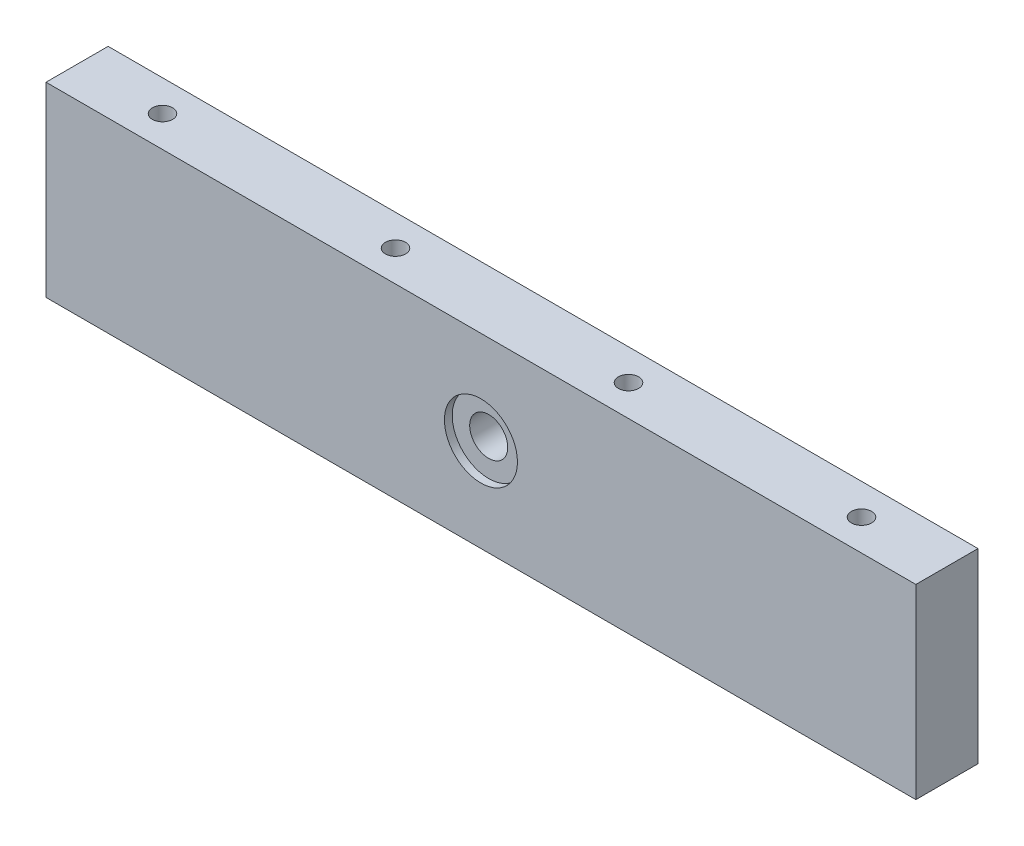
ISO-10303-21;
HEADER;
FILE_DESCRIPTION(('STEP AP214'),'2;1');
FILE_NAME('part.step','',(''),(''),'','','');
FILE_SCHEMA(('AUTOMOTIVE_DESIGN { 1 0 10303 214 1 1 1 1 }'));
ENDSEC;
DATA;
#1=APPLICATION_CONTEXT('core data for automotive mechanical design processes');
#2=APPLICATION_PROTOCOL_DEFINITION('international standard','automotive_design',2000,#1);
#3=PRODUCT_CONTEXT('',#1,'mechanical');
#4=PRODUCT('Part','Part','',(#3));
#5=PRODUCT_RELATED_PRODUCT_CATEGORY('part','',(#4));
#6=PRODUCT_DEFINITION_FORMATION('','',#4);
#7=PRODUCT_DEFINITION_CONTEXT('part definition',#1,'design');
#8=PRODUCT_DEFINITION('design','',#6,#7);
#9=PRODUCT_DEFINITION_SHAPE('','',#8);
#10=(LENGTH_UNIT() NAMED_UNIT(*) SI_UNIT(.MILLI.,.METRE.));
#11=(NAMED_UNIT(*) PLANE_ANGLE_UNIT() SI_UNIT($,.RADIAN.));
#12=(NAMED_UNIT(*) SI_UNIT($,.STERADIAN.) SOLID_ANGLE_UNIT());
#13=UNCERTAINTY_MEASURE_WITH_UNIT(LENGTH_MEASURE(1.E-05),#10,'distance_accuracy_value','');
#14=(GEOMETRIC_REPRESENTATION_CONTEXT(3) GLOBAL_UNCERTAINTY_ASSIGNED_CONTEXT((#13)) GLOBAL_UNIT_ASSIGNED_CONTEXT((#10,
#11,#12)) REPRESENTATION_CONTEXT('',''));
#15=CARTESIAN_POINT('',(0.,0.,0.));
#16=DIRECTION('',(0.,0.,1.));
#17=DIRECTION('',(1.,0.,0.));
#18=AXIS2_PLACEMENT_3D('',#15,#16,#17);
#19=CARTESIAN_POINT('',(0.,0.,30.));
#20=DIRECTION('',(0.,0.,-1.));
#21=DIRECTION('',(-1.,0.,0.));
#22=AXIS2_PLACEMENT_3D('',#19,#20,#21);
#23=CYLINDRICAL_SURFACE('',#22,2.45);
#24=CARTESIAN_POINT('',(0.,0.,2.));
#25=DIRECTION('',(0.,0.,-1.));
#26=DIRECTION('',(-1.,0.,0.));
#27=AXIS2_PLACEMENT_3D('',#24,#25,#26);
#28=CIRCLE('',#27,2.45);
#29=CARTESIAN_POINT('',(-2.45,0.,2.));
#30=VERTEX_POINT('',#29);
#31=EDGE_CURVE('E173',#30,#30,#28,.F.);
#32=ORIENTED_EDGE('',*,*,#31,.F.);
#33=EDGE_LOOP('',(#32));
#34=FACE_BOUND('',#33,.T.);
#35=CARTESIAN_POINT('',(0.,0.,7.));
#36=DIRECTION('',(0.,0.,1.));
#37=DIRECTION('',(1.,0.,0.));
#38=AXIS2_PLACEMENT_3D('',#35,#36,#37);
#39=CIRCLE('',#38,2.45);
#40=CARTESIAN_POINT('',(2.45,0.,7.));
#41=VERTEX_POINT('',#40);
#42=EDGE_CURVE('E38',#41,#41,#39,.F.);
#43=ORIENTED_EDGE('',*,*,#42,.F.);
#44=EDGE_LOOP('',(#43));
#45=FACE_BOUND('',#44,.T.);
#46=ADVANCED_FACE('F34',(#34,#45),#23,.F.);
#47=CARTESIAN_POINT('',(56.,-12.,8.));
#48=DIRECTION('',(-1.,0.,0.));
#49=DIRECTION('',(0.,0.,1.));
#50=AXIS2_PLACEMENT_3D('',#47,#48,#49);
#51=PLANE('',#50);
#52=DIRECTION('',(0.,1.,0.));
#53=VECTOR('',#52,1.);
#54=CARTESIAN_POINT('',(56.,-12.,0.));
#55=LINE('',#54,#53);
#56=CARTESIAN_POINT('',(56.,-12.,0.));
#57=VERTEX_POINT('',#56);
#58=CARTESIAN_POINT('',(56.,12.,0.));
#59=VERTEX_POINT('',#58);
#60=EDGE_CURVE('E204',#57,#59,#55,.T.);
#61=ORIENTED_EDGE('',*,*,#60,.T.);
#62=DIRECTION('',(0.,0.,-1.));
#63=VECTOR('',#62,1.);
#64=CARTESIAN_POINT('',(56.,12.,8.));
#65=LINE('',#64,#63);
#66=CARTESIAN_POINT('',(56.,12.,8.));
#67=VERTEX_POINT('',#66);
#68=EDGE_CURVE('E11',#67,#59,#65,.T.);
#69=ORIENTED_EDGE('',*,*,#68,.F.);
#70=DIRECTION('',(0.,1.,0.));
#71=VECTOR('',#70,1.);
#72=CARTESIAN_POINT('',(56.,-12.,8.));
#73=LINE('',#72,#71);
#74=CARTESIAN_POINT('',(56.,-12.,8.));
#75=VERTEX_POINT('',#74);
#76=EDGE_CURVE('E197',#75,#67,#73,.T.);
#77=ORIENTED_EDGE('',*,*,#76,.F.);
#78=DIRECTION('',(0.,0.,-1.));
#79=VECTOR('',#78,1.);
#80=CARTESIAN_POINT('',(56.,-12.,8.));
#81=LINE('',#80,#79);
#82=EDGE_CURVE('E203',#75,#57,#81,.T.);
#83=ORIENTED_EDGE('',*,*,#82,.T.);
#84=EDGE_LOOP('',(#61,#69,#77,#83));
#85=FACE_BOUND('',#84,.T.);
#86=ADVANCED_FACE('F36',(#85),#51,.F.);
#87=CARTESIAN_POINT('',(-56.,12.,8.));
#88=DIRECTION('',(0.,-1.,0.));
#89=DIRECTION('',(0.,0.,-1.));
#90=AXIS2_PLACEMENT_3D('',#87,#88,#89);
#91=PLANE('',#90);
#92=CARTESIAN_POINT('',(15.0000000000001,12.,4.));
#93=DIRECTION('',(0.,1.,0.));
#94=DIRECTION('',(0.,0.,-1.));
#95=AXIS2_PLACEMENT_3D('',#92,#93,#94);
#96=CIRCLE('',#95,1.3);
#97=CARTESIAN_POINT('',(15.0000000000001,12.,2.7));
#98=VERTEX_POINT('',#97);
#99=EDGE_CURVE('E181',#98,#98,#96,.T.);
#100=ORIENTED_EDGE('',*,*,#99,.F.);
#101=EDGE_LOOP('',(#100));
#102=FACE_BOUND('',#101,.T.);
#103=CARTESIAN_POINT('',(45.0000000000001,12.,4.));
#104=DIRECTION('',(0.,1.,0.));
#105=DIRECTION('',(0.,0.,-1.));
#106=AXIS2_PLACEMENT_3D('',#103,#104,#105);
#107=CIRCLE('',#106,1.3);
#108=CARTESIAN_POINT('',(45.0000000000001,12.,2.7));
#109=VERTEX_POINT('',#108);
#110=EDGE_CURVE('E185',#109,#109,#107,.T.);
#111=ORIENTED_EDGE('',*,*,#110,.F.);
#112=EDGE_LOOP('',(#111));
#113=FACE_BOUND('',#112,.T.);
#114=CARTESIAN_POINT('',(-45.,12.,4.));
#115=DIRECTION('',(0.,1.,0.));
#116=DIRECTION('',(0.,0.,1.));
#117=AXIS2_PLACEMENT_3D('',#114,#115,#116);
#118=CIRCLE('',#117,1.3);
#119=CARTESIAN_POINT('',(-45.,12.,5.3));
#120=VERTEX_POINT('',#119);
#121=EDGE_CURVE('E189',#120,#120,#118,.T.);
#122=ORIENTED_EDGE('',*,*,#121,.F.);
#123=EDGE_LOOP('',(#122));
#124=FACE_BOUND('',#123,.T.);
#125=CARTESIAN_POINT('',(-15.,12.,4.));
#126=DIRECTION('',(0.,1.,0.));
#127=DIRECTION('',(0.,0.,1.));
#128=AXIS2_PLACEMENT_3D('',#125,#126,#127);
#129=CIRCLE('',#128,1.3);
#130=CARTESIAN_POINT('',(-15.,12.,5.3));
#131=VERTEX_POINT('',#130);
#132=EDGE_CURVE('E193',#131,#131,#129,.T.);
#133=ORIENTED_EDGE('',*,*,#132,.F.);
#134=EDGE_LOOP('',(#133));
#135=FACE_BOUND('',#134,.T.);
#136=DIRECTION('',(-1.,0.,0.));
#137=VECTOR('',#136,1.);
#138=CARTESIAN_POINT('',(-56.,12.,0.));
#139=LINE('',#138,#137);
#140=CARTESIAN_POINT('',(-56.,12.,0.));
#141=VERTEX_POINT('',#140);
#142=EDGE_CURVE('E207',#59,#141,#139,.T.);
#143=ORIENTED_EDGE('',*,*,#142,.T.);
#144=DIRECTION('',(0.,0.,-1.));
#145=VECTOR('',#144,1.);
#146=CARTESIAN_POINT('',(-56.,12.,8.));
#147=LINE('',#146,#145);
#148=CARTESIAN_POINT('',(-56.,12.,8.));
#149=VERTEX_POINT('',#148);
#150=EDGE_CURVE('E43',#149,#141,#147,.T.);
#151=ORIENTED_EDGE('',*,*,#150,.F.);
#152=DIRECTION('',(-1.,0.,0.));
#153=VECTOR('',#152,1.);
#154=CARTESIAN_POINT('',(-56.,12.,8.));
#155=LINE('',#154,#153);
#156=EDGE_CURVE('E88',#67,#149,#155,.T.);
#157=ORIENTED_EDGE('',*,*,#156,.F.);
#158=ORIENTED_EDGE('',*,*,#68,.T.);
#159=EDGE_LOOP('',(#143,#151,#157,#158));
#160=FACE_BOUND('',#159,.T.);
#161=ADVANCED_FACE('F251',(#102,#113,#124,#135,#160),#91,.F.);
#162=CARTESIAN_POINT('',(-56.,-12.,8.));
#163=DIRECTION('',(1.,0.,0.));
#164=DIRECTION('',(0.,0.,-1.));
#165=AXIS2_PLACEMENT_3D('',#162,#163,#164);
#166=PLANE('',#165);
#167=DIRECTION('',(0.,-1.,0.));
#168=VECTOR('',#167,1.);
#169=CARTESIAN_POINT('',(-56.,-12.,0.));
#170=LINE('',#169,#168);
#171=CARTESIAN_POINT('',(-56.,-12.,0.));
#172=VERTEX_POINT('',#171);
#173=EDGE_CURVE('E209',#141,#172,#170,.T.);
#174=ORIENTED_EDGE('',*,*,#173,.T.);
#175=DIRECTION('',(0.,0.,-1.));
#176=VECTOR('',#175,1.);
#177=CARTESIAN_POINT('',(-56.,-12.,8.));
#178=LINE('',#177,#176);
#179=CARTESIAN_POINT('',(-56.,-12.,8.));
#180=VERTEX_POINT('',#179);
#181=EDGE_CURVE('E213',#180,#172,#178,.T.);
#182=ORIENTED_EDGE('',*,*,#181,.F.);
#183=DIRECTION('',(0.,-1.,0.));
#184=VECTOR('',#183,1.);
#185=CARTESIAN_POINT('',(-56.,-12.,8.));
#186=LINE('',#185,#184);
#187=EDGE_CURVE('E200',#149,#180,#186,.T.);
#188=ORIENTED_EDGE('',*,*,#187,.F.);
#189=ORIENTED_EDGE('',*,*,#150,.T.);
#190=EDGE_LOOP('',(#174,#182,#188,#189));
#191=FACE_BOUND('',#190,.T.);
#192=ADVANCED_FACE('F256',(#191),#166,.F.);
#193=CARTESIAN_POINT('',(-56.,-12.,8.));
#194=DIRECTION('',(0.,1.,0.));
#195=DIRECTION('',(0.,0.,1.));
#196=AXIS2_PLACEMENT_3D('',#193,#194,#195);
#197=PLANE('',#196);
#198=CARTESIAN_POINT('',(15.0000000000001,-12.,4.));
#199=DIRECTION('',(0.,1.,0.));
#200=DIRECTION('',(0.,0.,1.));
#201=AXIS2_PLACEMENT_3D('',#198,#199,#200);
#202=CIRCLE('',#201,1.3);
#203=CARTESIAN_POINT('',(15.0000000000001,-12.,5.3));
#204=VERTEX_POINT('',#203);
#205=EDGE_CURVE('E184',#204,#204,#202,.T.);
#206=ORIENTED_EDGE('',*,*,#205,.T.);
#207=EDGE_LOOP('',(#206));
#208=FACE_BOUND('',#207,.T.);
#209=CARTESIAN_POINT('',(45.0000000000001,-12.,4.));
#210=DIRECTION('',(0.,1.,0.));
#211=DIRECTION('',(0.,0.,1.));
#212=AXIS2_PLACEMENT_3D('',#209,#210,#211);
#213=CIRCLE('',#212,1.3);
#214=CARTESIAN_POINT('',(45.0000000000001,-12.,5.3));
#215=VERTEX_POINT('',#214);
#216=EDGE_CURVE('E188',#215,#215,#213,.T.);
#217=ORIENTED_EDGE('',*,*,#216,.T.);
#218=EDGE_LOOP('',(#217));
#219=FACE_BOUND('',#218,.T.);
#220=CARTESIAN_POINT('',(-45.,-12.,4.));
#221=DIRECTION('',(0.,1.,0.));
#222=DIRECTION('',(0.,0.,1.));
#223=AXIS2_PLACEMENT_3D('',#220,#221,#222);
#224=CIRCLE('',#223,1.3);
#225=CARTESIAN_POINT('',(-45.,-12.,5.3));
#226=VERTEX_POINT('',#225);
#227=EDGE_CURVE('E192',#226,#226,#224,.T.);
#228=ORIENTED_EDGE('',*,*,#227,.T.);
#229=EDGE_LOOP('',(#228));
#230=FACE_BOUND('',#229,.T.);
#231=CARTESIAN_POINT('',(-15.,-12.,4.));
#232=DIRECTION('',(0.,1.,0.));
#233=DIRECTION('',(0.,0.,1.));
#234=AXIS2_PLACEMENT_3D('',#231,#232,#233);
#235=CIRCLE('',#234,1.3);
#236=CARTESIAN_POINT('',(-15.,-12.,5.3));
#237=VERTEX_POINT('',#236);
#238=EDGE_CURVE('E196',#237,#237,#235,.T.);
#239=ORIENTED_EDGE('',*,*,#238,.T.);
#240=EDGE_LOOP('',(#239));
#241=FACE_BOUND('',#240,.T.);
#242=DIRECTION('',(1.,0.,0.));
#243=VECTOR('',#242,1.);
#244=CARTESIAN_POINT('',(-56.,-12.,0.));
#245=LINE('',#244,#243);
#246=EDGE_CURVE('E81',#172,#57,#245,.T.);
#247=ORIENTED_EDGE('',*,*,#246,.T.);
#248=ORIENTED_EDGE('',*,*,#82,.F.);
#249=DIRECTION('',(1.,0.,0.));
#250=VECTOR('',#249,1.);
#251=CARTESIAN_POINT('',(-56.,-12.,8.));
#252=LINE('',#251,#250);
#253=EDGE_CURVE('E60',#180,#75,#252,.T.);
#254=ORIENTED_EDGE('',*,*,#253,.F.);
#255=ORIENTED_EDGE('',*,*,#181,.T.);
#256=EDGE_LOOP('',(#247,#248,#254,#255));
#257=FACE_BOUND('',#256,.T.);
#258=ADVANCED_FACE('F245',(#208,#219,#230,#241,#257),#197,.F.);
#259=CARTESIAN_POINT('',(0.,0.,8.));
#260=DIRECTION('',(0.,0.,-1.));
#261=DIRECTION('',(-1.,0.,0.));
#262=AXIS2_PLACEMENT_3D('',#259,#260,#261);
#263=PLANE('',#262);
#264=CARTESIAN_POINT('',(0.,0.,8.));
#265=DIRECTION('',(0.,0.,1.));
#266=DIRECTION('',(1.,0.,0.));
#267=AXIS2_PLACEMENT_3D('',#264,#265,#266);
#268=CIRCLE('',#267,4.7);
#269=CARTESIAN_POINT('',(4.7,0.,8.));
#270=VERTEX_POINT('',#269);
#271=EDGE_CURVE('E150',#270,#270,#268,.T.);
#272=ORIENTED_EDGE('',*,*,#271,.F.);
#273=EDGE_LOOP('',(#272));
#274=FACE_BOUND('',#273,.T.);
#275=ORIENTED_EDGE('',*,*,#76,.T.);
#276=ORIENTED_EDGE('',*,*,#156,.T.);
#277=ORIENTED_EDGE('',*,*,#187,.T.);
#278=ORIENTED_EDGE('',*,*,#253,.T.);
#279=EDGE_LOOP('',(#275,#276,#277,#278));
#280=FACE_BOUND('',#279,.T.);
#281=ADVANCED_FACE('F242',(#274,#280),#263,.F.);
#282=CARTESIAN_POINT('',(0.,0.,0.));
#283=DIRECTION('',(0.,0.,-1.));
#284=DIRECTION('',(-1.,0.,0.));
#285=AXIS2_PLACEMENT_3D('',#282,#283,#284);
#286=PLANE('',#285);
#287=DIRECTION('',(-0.827725914255366,0.561132614334721,0.));
#288=VECTOR('',#287,1.);
#289=CARTESIAN_POINT('',(-0.324654856204209,-4.49161432275114,0.));
#290=LINE('',#289,#288);
#291=CARTESIAN_POINT('',(-0.324654856204209,-4.49161432275114,0.));
#292=VERTEX_POINT('',#291);
#293=CARTESIAN_POINT('',(-4.05217953560663,-1.96464780844074,0.));
#294=VERTEX_POINT('',#293);
#295=EDGE_CURVE('E51',#292,#294,#290,.T.);
#296=ORIENTED_EDGE('',*,*,#295,.F.);
#297=DIRECTION('',(-0.899818056033527,-0.436265361948487,0.));
#298=VECTOR('',#297,1.);
#299=CARTESIAN_POINT('',(3.72752467940242,-2.5269665143104,0.));
#300=LINE('',#299,#298);
#301=CARTESIAN_POINT('',(3.72752467940242,-2.5269665143104,0.));
#302=VERTEX_POINT('',#301);
#303=EDGE_CURVE('E144',#302,#292,#300,.T.);
#304=ORIENTED_EDGE('',*,*,#303,.F.);
#305=DIRECTION('',(-0.072092141778161,-0.997397976283207,0.));
#306=VECTOR('',#305,1.);
#307=CARTESIAN_POINT('',(4.05217953560663,1.96464780844074,0.));
#308=LINE('',#307,#306);
#309=CARTESIAN_POINT('',(4.05217953560663,1.96464780844074,0.));
#310=VERTEX_POINT('',#309);
#311=EDGE_CURVE('E147',#310,#302,#308,.T.);
#312=ORIENTED_EDGE('',*,*,#311,.F.);
#313=DIRECTION('',(0.827725914255366,-0.561132614334721,0.));
#314=VECTOR('',#313,1.);
#315=CARTESIAN_POINT('',(0.324654856204211,4.49161432275114,0.));
#316=LINE('',#315,#314);
#317=CARTESIAN_POINT('',(0.324654856204211,4.49161432275114,0.));
#318=VERTEX_POINT('',#317);
#319=EDGE_CURVE('E166',#318,#310,#316,.T.);
#320=ORIENTED_EDGE('',*,*,#319,.F.);
#321=DIRECTION('',(0.899818056033527,0.436265361948487,0.));
#322=VECTOR('',#321,1.);
#323=CARTESIAN_POINT('',(-3.72752467940242,2.5269665143104,0.));
#324=LINE('',#323,#322);
#325=CARTESIAN_POINT('',(-3.72752467940242,2.5269665143104,0.));
#326=VERTEX_POINT('',#325);
#327=EDGE_CURVE('E163',#326,#318,#324,.T.);
#328=ORIENTED_EDGE('',*,*,#327,.F.);
#329=DIRECTION('',(0.0720921417781608,0.997397976283207,0.));
#330=VECTOR('',#329,1.);
#331=CARTESIAN_POINT('',(-4.05217953560663,-1.96464780844074,0.));
#332=LINE('',#331,#330);
#333=EDGE_CURVE('E161',#294,#326,#332,.T.);
#334=ORIENTED_EDGE('',*,*,#333,.F.);
#335=EDGE_LOOP('',(#296,#304,#312,#320,#328,#334));
#336=FACE_BOUND('',#335,.T.);
#337=ORIENTED_EDGE('',*,*,#60,.F.);
#338=ORIENTED_EDGE('',*,*,#246,.F.);
#339=ORIENTED_EDGE('',*,*,#173,.F.);
#340=ORIENTED_EDGE('',*,*,#142,.F.);
#341=EDGE_LOOP('',(#337,#338,#339,#340));
#342=FACE_BOUND('',#341,.T.);
#343=ADVANCED_FACE('F244',(#336,#342),#286,.T.);
#344=CARTESIAN_POINT('',(-15.,-18.,4.));
#345=DIRECTION('',(0.,1.,0.));
#346=DIRECTION('',(0.,0.,1.));
#347=AXIS2_PLACEMENT_3D('',#344,#345,#346);
#348=CYLINDRICAL_SURFACE('',#347,1.3);
#349=ORIENTED_EDGE('',*,*,#132,.T.);
#350=EDGE_LOOP('',(#349));
#351=FACE_BOUND('',#350,.T.);
#352=ORIENTED_EDGE('',*,*,#238,.F.);
#353=EDGE_LOOP('',(#352));
#354=FACE_BOUND('',#353,.T.);
#355=ADVANCED_FACE('F259',(#351,#354),#348,.F.);
#356=CARTESIAN_POINT('',(-45.,-18.,4.));
#357=DIRECTION('',(0.,1.,0.));
#358=DIRECTION('',(0.,0.,1.));
#359=AXIS2_PLACEMENT_3D('',#356,#357,#358);
#360=CYLINDRICAL_SURFACE('',#359,1.3);
#361=ORIENTED_EDGE('',*,*,#121,.T.);
#362=EDGE_LOOP('',(#361));
#363=FACE_BOUND('',#362,.T.);
#364=ORIENTED_EDGE('',*,*,#227,.F.);
#365=EDGE_LOOP('',(#364));
#366=FACE_BOUND('',#365,.T.);
#367=ADVANCED_FACE('F265',(#363,#366),#360,.F.);
#368=CARTESIAN_POINT('',(45.0000000000001,-18.,4.));
#369=DIRECTION('',(0.,1.,0.));
#370=DIRECTION('',(0.,0.,1.));
#371=AXIS2_PLACEMENT_3D('',#368,#369,#370);
#372=CYLINDRICAL_SURFACE('',#371,1.3);
#373=ORIENTED_EDGE('',*,*,#110,.T.);
#374=EDGE_LOOP('',(#373));
#375=FACE_BOUND('',#374,.T.);
#376=ORIENTED_EDGE('',*,*,#216,.F.);
#377=EDGE_LOOP('',(#376));
#378=FACE_BOUND('',#377,.T.);
#379=ADVANCED_FACE('F291',(#375,#378),#372,.F.);
#380=CARTESIAN_POINT('',(15.0000000000001,-18.,4.));
#381=DIRECTION('',(0.,1.,0.));
#382=DIRECTION('',(0.,0.,1.));
#383=AXIS2_PLACEMENT_3D('',#380,#381,#382);
#384=CYLINDRICAL_SURFACE('',#383,1.3);
#385=ORIENTED_EDGE('',*,*,#99,.T.);
#386=EDGE_LOOP('',(#385));
#387=FACE_BOUND('',#386,.T.);
#388=ORIENTED_EDGE('',*,*,#205,.F.);
#389=EDGE_LOOP('',(#388));
#390=FACE_BOUND('',#389,.T.);
#391=ADVANCED_FACE('F298',(#387,#390),#384,.F.);
#392=CARTESIAN_POINT('',(0.,0.,2.));
#393=DIRECTION('',(0.,0.,-1.));
#394=DIRECTION('',(-1.,0.,0.));
#395=AXIS2_PLACEMENT_3D('',#392,#393,#394);
#396=PLANE('',#395);
#397=DIRECTION('',(-0.827725914255366,0.561132614334721,0.));
#398=VECTOR('',#397,1.);
#399=CARTESIAN_POINT('',(-0.324654856204209,-4.49161432275114,2.));
#400=LINE('',#399,#398);
#401=CARTESIAN_POINT('',(-0.324654856204209,-4.49161432275114,2.));
#402=VERTEX_POINT('',#401);
#403=CARTESIAN_POINT('',(-4.05217953560663,-1.96464780844074,2.));
#404=VERTEX_POINT('',#403);
#405=EDGE_CURVE('E124',#402,#404,#400,.T.);
#406=ORIENTED_EDGE('',*,*,#405,.T.);
#407=DIRECTION('',(0.0720921417781608,0.997397976283207,0.));
#408=VECTOR('',#407,1.);
#409=CARTESIAN_POINT('',(-4.05217953560663,-1.96464780844074,2.));
#410=LINE('',#409,#408);
#411=CARTESIAN_POINT('',(-3.72752467940242,2.5269665143104,2.));
#412=VERTEX_POINT('',#411);
#413=EDGE_CURVE('E133',#404,#412,#410,.T.);
#414=ORIENTED_EDGE('',*,*,#413,.T.);
#415=DIRECTION('',(0.899818056033527,0.436265361948487,0.));
#416=VECTOR('',#415,1.);
#417=CARTESIAN_POINT('',(-3.72752467940242,2.5269665143104,2.));
#418=LINE('',#417,#416);
#419=CARTESIAN_POINT('',(0.324654856204211,4.49161432275114,2.));
#420=VERTEX_POINT('',#419);
#421=EDGE_CURVE('E138',#412,#420,#418,.T.);
#422=ORIENTED_EDGE('',*,*,#421,.T.);
#423=DIRECTION('',(0.827725914255366,-0.561132614334721,0.));
#424=VECTOR('',#423,1.);
#425=CARTESIAN_POINT('',(0.324654856204211,4.49161432275114,2.));
#426=LINE('',#425,#424);
#427=CARTESIAN_POINT('',(4.05217953560663,1.96464780844074,2.));
#428=VERTEX_POINT('',#427);
#429=EDGE_CURVE('E154',#420,#428,#426,.T.);
#430=ORIENTED_EDGE('',*,*,#429,.T.);
#431=DIRECTION('',(-0.072092141778161,-0.997397976283207,0.));
#432=VECTOR('',#431,1.);
#433=CARTESIAN_POINT('',(4.05217953560663,1.96464780844074,2.));
#434=LINE('',#433,#432);
#435=CARTESIAN_POINT('',(3.72752467940242,-2.5269665143104,2.));
#436=VERTEX_POINT('',#435);
#437=EDGE_CURVE('E157',#428,#436,#434,.T.);
#438=ORIENTED_EDGE('',*,*,#437,.T.);
#439=DIRECTION('',(-0.899818056033527,-0.436265361948487,0.));
#440=VECTOR('',#439,1.);
#441=CARTESIAN_POINT('',(3.72752467940242,-2.5269665143104,2.));
#442=LINE('',#441,#440);
#443=EDGE_CURVE('E130',#436,#402,#442,.T.);
#444=ORIENTED_EDGE('',*,*,#443,.T.);
#445=EDGE_LOOP('',(#406,#414,#422,#430,#438,#444));
#446=FACE_BOUND('',#445,.T.);
#447=ORIENTED_EDGE('',*,*,#31,.T.);
#448=EDGE_LOOP('',(#447));
#449=FACE_BOUND('',#448,.T.);
#450=ADVANCED_FACE('F140',(#446,#449),#396,.T.);
#451=CARTESIAN_POINT('',(-0.324654856204209,-4.49161432275114,2.));
#452=DIRECTION('',(-0.561132614334721,-0.827725914255366,0.));
#453=DIRECTION('',(0.827725914255366,-0.561132614334721,0.));
#454=AXIS2_PLACEMENT_3D('',#451,#452,#453);
#455=PLANE('',#454);
#456=ORIENTED_EDGE('',*,*,#295,.T.);
#457=DIRECTION('',(0.,0.,-1.));
#458=VECTOR('',#457,1.);
#459=CARTESIAN_POINT('',(-4.05217953560663,-1.96464780844074,2.));
#460=LINE('',#459,#458);
#461=EDGE_CURVE('E120',#404,#294,#460,.T.);
#462=ORIENTED_EDGE('',*,*,#461,.F.);
#463=ORIENTED_EDGE('',*,*,#405,.F.);
#464=DIRECTION('',(0.,0.,-1.));
#465=VECTOR('',#464,1.);
#466=CARTESIAN_POINT('',(-0.324654856204209,-4.49161432275114,2.));
#467=LINE('',#466,#465);
#468=EDGE_CURVE('E171',#402,#292,#467,.T.);
#469=ORIENTED_EDGE('',*,*,#468,.T.);
#470=EDGE_LOOP('',(#456,#462,#463,#469));
#471=FACE_BOUND('',#470,.T.);
#472=ADVANCED_FACE('F122',(#471),#455,.F.);
#473=CARTESIAN_POINT('',(3.72752467940242,-2.5269665143104,2.));
#474=DIRECTION('',(0.436265361948487,-0.899818056033527,0.));
#475=DIRECTION('',(0.899818056033527,0.436265361948487,0.));
#476=AXIS2_PLACEMENT_3D('',#473,#474,#475);
#477=PLANE('',#476);
#478=ORIENTED_EDGE('',*,*,#303,.T.);
#479=ORIENTED_EDGE('',*,*,#468,.F.);
#480=ORIENTED_EDGE('',*,*,#443,.F.);
#481=DIRECTION('',(0.,0.,-1.));
#482=VECTOR('',#481,1.);
#483=CARTESIAN_POINT('',(3.72752467940242,-2.5269665143104,2.));
#484=LINE('',#483,#482);
#485=EDGE_CURVE('E174',#436,#302,#484,.T.);
#486=ORIENTED_EDGE('',*,*,#485,.T.);
#487=EDGE_LOOP('',(#478,#479,#480,#486));
#488=FACE_BOUND('',#487,.T.);
#489=ADVANCED_FACE('F307',(#488),#477,.F.);
#490=CARTESIAN_POINT('',(4.05217953560663,1.96464780844074,2.));
#491=DIRECTION('',(0.997397976283207,-0.072092141778161,0.));
#492=DIRECTION('',(0.072092141778161,0.997397976283208,0.));
#493=AXIS2_PLACEMENT_3D('',#490,#491,#492);
#494=PLANE('',#493);
#495=ORIENTED_EDGE('',*,*,#311,.T.);
#496=ORIENTED_EDGE('',*,*,#485,.F.);
#497=ORIENTED_EDGE('',*,*,#437,.F.);
#498=DIRECTION('',(0.,0.,-1.));
#499=VECTOR('',#498,1.);
#500=CARTESIAN_POINT('',(4.05217953560663,1.96464780844074,2.));
#501=LINE('',#500,#499);
#502=EDGE_CURVE('E176',#428,#310,#501,.T.);
#503=ORIENTED_EDGE('',*,*,#502,.T.);
#504=EDGE_LOOP('',(#495,#496,#497,#503));
#505=FACE_BOUND('',#504,.T.);
#506=ADVANCED_FACE('F318',(#505),#494,.F.);
#507=CARTESIAN_POINT('',(0.324654856204211,4.49161432275114,2.));
#508=DIRECTION('',(0.561132614334721,0.827725914255366,0.));
#509=DIRECTION('',(-0.827725914255366,0.561132614334721,0.));
#510=AXIS2_PLACEMENT_3D('',#507,#508,#509);
#511=PLANE('',#510);
#512=ORIENTED_EDGE('',*,*,#319,.T.);
#513=ORIENTED_EDGE('',*,*,#502,.F.);
#514=ORIENTED_EDGE('',*,*,#429,.F.);
#515=DIRECTION('',(0.,0.,-1.));
#516=VECTOR('',#515,1.);
#517=CARTESIAN_POINT('',(0.324654856204211,4.49161432275114,2.));
#518=LINE('',#517,#516);
#519=EDGE_CURVE('E178',#420,#318,#518,.T.);
#520=ORIENTED_EDGE('',*,*,#519,.T.);
#521=EDGE_LOOP('',(#512,#513,#514,#520));
#522=FACE_BOUND('',#521,.T.);
#523=ADVANCED_FACE('F314',(#522),#511,.F.);
#524=CARTESIAN_POINT('',(-3.72752467940242,2.5269665143104,2.));
#525=DIRECTION('',(-0.436265361948487,0.899818056033527,0.));
#526=DIRECTION('',(-0.899818056033527,-0.436265361948487,0.));
#527=AXIS2_PLACEMENT_3D('',#524,#525,#526);
#528=PLANE('',#527);
#529=ORIENTED_EDGE('',*,*,#327,.T.);
#530=ORIENTED_EDGE('',*,*,#519,.F.);
#531=ORIENTED_EDGE('',*,*,#421,.F.);
#532=DIRECTION('',(0.,0.,-1.));
#533=VECTOR('',#532,1.);
#534=CARTESIAN_POINT('',(-3.72752467940242,2.5269665143104,2.));
#535=LINE('',#534,#533);
#536=EDGE_CURVE('E129',#412,#326,#535,.T.);
#537=ORIENTED_EDGE('',*,*,#536,.T.);
#538=EDGE_LOOP('',(#529,#530,#531,#537));
#539=FACE_BOUND('',#538,.T.);
#540=ADVANCED_FACE('F311',(#539),#528,.F.);
#541=CARTESIAN_POINT('',(-4.05217953560663,-1.96464780844074,2.));
#542=DIRECTION('',(-0.997397976283207,0.0720921417781608,0.));
#543=DIRECTION('',(-0.0720921417781608,-0.997397976283208,0.));
#544=AXIS2_PLACEMENT_3D('',#541,#542,#543);
#545=PLANE('',#544);
#546=ORIENTED_EDGE('',*,*,#333,.T.);
#547=ORIENTED_EDGE('',*,*,#536,.F.);
#548=ORIENTED_EDGE('',*,*,#413,.F.);
#549=ORIENTED_EDGE('',*,*,#461,.T.);
#550=EDGE_LOOP('',(#546,#547,#548,#549));
#551=FACE_BOUND('',#550,.T.);
#552=ADVANCED_FACE('F134',(#551),#545,.F.);
#553=CARTESIAN_POINT('',(0.,0.,7.));
#554=DIRECTION('',(0.,0.,1.));
#555=DIRECTION('',(1.,0.,0.));
#556=AXIS2_PLACEMENT_3D('',#553,#554,#555);
#557=PLANE('',#556);
#558=CARTESIAN_POINT('',(0.,0.,7.));
#559=DIRECTION('',(0.,0.,1.));
#560=DIRECTION('',(1.,0.,0.));
#561=AXIS2_PLACEMENT_3D('',#558,#559,#560);
#562=CIRCLE('',#561,4.7);
#563=CARTESIAN_POINT('',(4.7,0.,7.));
#564=VERTEX_POINT('',#563);
#565=EDGE_CURVE('E233',#564,#564,#562,.T.);
#566=ORIENTED_EDGE('',*,*,#565,.T.);
#567=EDGE_LOOP('',(#566));
#568=FACE_BOUND('',#567,.T.);
#569=ORIENTED_EDGE('',*,*,#42,.T.);
#570=EDGE_LOOP('',(#569));
#571=FACE_BOUND('',#570,.T.);
#572=ADVANCED_FACE('F310',(#568,#571),#557,.T.);
#573=CARTESIAN_POINT('',(0.,0.,7.));
#574=DIRECTION('',(0.,0.,1.));
#575=DIRECTION('',(1.,0.,0.));
#576=AXIS2_PLACEMENT_3D('',#573,#574,#575);
#577=CYLINDRICAL_SURFACE('',#576,4.7);
#578=ORIENTED_EDGE('',*,*,#565,.F.);
#579=EDGE_LOOP('',(#578));
#580=FACE_BOUND('',#579,.T.);
#581=ORIENTED_EDGE('',*,*,#271,.T.);
#582=EDGE_LOOP('',(#581));
#583=FACE_BOUND('',#582,.T.);
#584=ADVANCED_FACE('F240',(#580,#583),#577,.F.);
#585=CLOSED_SHELL('',(#46,#86,#161,#192,#258,#281,#343,#355,#367,#379,#391,#450,#472,#489,#506,
#523,#540,#552,#572,#584));
#586=MANIFOLD_SOLID_BREP('B2',#585);
#587=ADVANCED_BREP_SHAPE_REPRESENTATION('',(#18,#586),#14);
#588=SHAPE_DEFINITION_REPRESENTATION(#9,#587);
ENDSEC;
END-ISO-10303-21;
